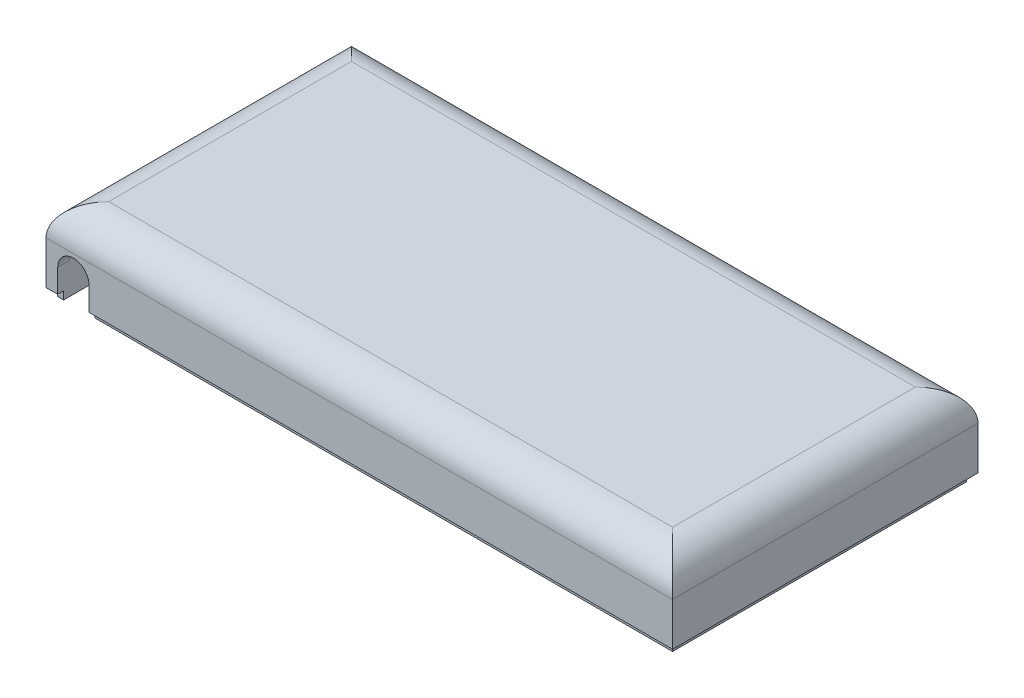
ISO-10303-21;
HEADER;
FILE_DESCRIPTION(('STEP AP214'),'2;1');
FILE_NAME('part.step','',(''),(''),'','','');
FILE_SCHEMA(('AUTOMOTIVE_DESIGN { 1 0 10303 214 1 1 1 1 }'));
ENDSEC;
DATA;
#1=APPLICATION_CONTEXT('core data for automotive mechanical design processes');
#2=APPLICATION_PROTOCOL_DEFINITION('international standard','automotive_design',2000,#1);
#3=PRODUCT_CONTEXT('',#1,'mechanical');
#4=PRODUCT('Part','Part','',(#3));
#5=PRODUCT_RELATED_PRODUCT_CATEGORY('part','',(#4));
#6=PRODUCT_DEFINITION_FORMATION('','',#4);
#7=PRODUCT_DEFINITION_CONTEXT('part definition',#1,'design');
#8=PRODUCT_DEFINITION('design','',#6,#7);
#9=PRODUCT_DEFINITION_SHAPE('','',#8);
#10=(LENGTH_UNIT() NAMED_UNIT(*) SI_UNIT(.MILLI.,.METRE.));
#11=(NAMED_UNIT(*) PLANE_ANGLE_UNIT() SI_UNIT($,.RADIAN.));
#12=(NAMED_UNIT(*) SI_UNIT($,.STERADIAN.) SOLID_ANGLE_UNIT());
#13=UNCERTAINTY_MEASURE_WITH_UNIT(LENGTH_MEASURE(1.E-05),#10,'distance_accuracy_value','');
#14=(GEOMETRIC_REPRESENTATION_CONTEXT(3) GLOBAL_UNCERTAINTY_ASSIGNED_CONTEXT((#13)) GLOBAL_UNIT_ASSIGNED_CONTEXT((#10,
#11,#12)) REPRESENTATION_CONTEXT('',''));
#15=CARTESIAN_POINT('',(0.,0.,0.));
#16=DIRECTION('',(0.,0.,1.));
#17=DIRECTION('',(1.,0.,0.));
#18=AXIS2_PLACEMENT_3D('',#15,#16,#17);
#19=CARTESIAN_POINT('',(39.25,1.,18.75));
#20=DIRECTION('',(0.,0.,1.));
#21=DIRECTION('',(1.,0.,0.));
#22=AXIS2_PLACEMENT_3D('',#19,#20,#21);
#23=PLANE('',#22);
#24=DIRECTION('',(0.,-1.,0.));
#25=VECTOR('',#24,1.);
#26=CARTESIAN_POINT('',(-34.5,-2.00000000000001,18.75));
#27=LINE('',#26,#25);
#28=CARTESIAN_POINT('',(-34.5,1.,18.75));
#29=VERTEX_POINT('',#28);
#30=CARTESIAN_POINT('',(-34.5,0.,18.75));
#31=VERTEX_POINT('',#30);
#32=EDGE_CURVE('E165',#29,#31,#27,.T.);
#33=ORIENTED_EDGE('',*,*,#32,.T.);
#34=DIRECTION('',(-1.,0.,0.));
#35=VECTOR('',#34,1.);
#36=CARTESIAN_POINT('',(39.25,0.,18.75));
#37=LINE('',#36,#35);
#38=CARTESIAN_POINT('',(39.25,0.,18.75));
#39=VERTEX_POINT('',#38);
#40=EDGE_CURVE('E210',#39,#31,#37,.T.);
#41=ORIENTED_EDGE('',*,*,#40,.F.);
#42=DIRECTION('',(0.,-1.,0.));
#43=VECTOR('',#42,1.);
#44=CARTESIAN_POINT('',(39.25,1.,18.75));
#45=LINE('',#44,#43);
#46=CARTESIAN_POINT('',(39.25,1.,18.75));
#47=VERTEX_POINT('',#46);
#48=EDGE_CURVE('E190',#47,#39,#45,.T.);
#49=ORIENTED_EDGE('',*,*,#48,.F.);
#50=DIRECTION('',(-1.,0.,0.));
#51=VECTOR('',#50,1.);
#52=CARTESIAN_POINT('',(39.25,1.,18.75));
#53=LINE('',#52,#51);
#54=EDGE_CURVE('E183',#47,#29,#53,.T.);
#55=ORIENTED_EDGE('',*,*,#54,.T.);
#56=EDGE_LOOP('',(#33,#41,#49,#55));
#57=FACE_BOUND('',#56,.T.);
#58=ADVANCED_FACE('F33',(#57),#23,.T.);
#59=CARTESIAN_POINT('',(0.,0.,0.));
#60=DIRECTION('',(0.,1.,0.));
#61=DIRECTION('',(0.,0.,1.));
#62=AXIS2_PLACEMENT_3D('',#59,#60,#61);
#63=PLANE('',#62);
#64=ORIENTED_EDGE('',*,*,#40,.T.);
#65=DIRECTION('',(0.,0.,1.));
#66=VECTOR('',#65,1.);
#67=CARTESIAN_POINT('',(-34.5,0.,-19.501));
#68=LINE('',#67,#66);
#69=CARTESIAN_POINT('',(-34.5,0.,18.));
#70=VERTEX_POINT('',#69);
#71=EDGE_CURVE('E172',#70,#31,#68,.T.);
#72=ORIENTED_EDGE('',*,*,#71,.F.);
#73=DIRECTION('',(1.,0.,0.));
#74=VECTOR('',#73,1.);
#75=CARTESIAN_POINT('',(-38.5,0.,18.));
#76=LINE('',#75,#74);
#77=CARTESIAN_POINT('',(38.5,0.,18.));
#78=VERTEX_POINT('',#77);
#79=EDGE_CURVE('E234',#70,#78,#76,.T.);
#80=ORIENTED_EDGE('',*,*,#79,.T.);
#81=DIRECTION('',(0.,0.,-1.));
#82=VECTOR('',#81,1.);
#83=CARTESIAN_POINT('',(38.5,0.,18.));
#84=LINE('',#83,#82);
#85=CARTESIAN_POINT('',(38.5,0.,-18.));
#86=VERTEX_POINT('',#85);
#87=EDGE_CURVE('E229',#78,#86,#84,.T.);
#88=ORIENTED_EDGE('',*,*,#87,.T.);
#89=DIRECTION('',(-1.,0.,0.));
#90=VECTOR('',#89,1.);
#91=CARTESIAN_POINT('',(-38.5,0.,-18.));
#92=LINE('',#91,#90);
#93=CARTESIAN_POINT('',(-38.5,0.,-18.));
#94=VERTEX_POINT('',#93);
#95=EDGE_CURVE('E246',#86,#94,#92,.T.);
#96=ORIENTED_EDGE('',*,*,#95,.T.);
#97=DIRECTION('',(0.,0.,1.));
#98=VECTOR('',#97,1.);
#99=CARTESIAN_POINT('',(-38.5,0.,18.));
#100=LINE('',#99,#98);
#101=CARTESIAN_POINT('',(-38.5,0.,18.75));
#102=VERTEX_POINT('',#101);
#103=EDGE_CURVE('E249',#94,#102,#100,.T.);
#104=ORIENTED_EDGE('',*,*,#103,.T.);
#105=CARTESIAN_POINT('',(-39.25,0.,18.75));
#106=VERTEX_POINT('',#105);
#107=EDGE_CURVE('E209',#102,#106,#37,.T.);
#108=ORIENTED_EDGE('',*,*,#107,.T.);
#109=DIRECTION('',(0.,0.,-1.));
#110=VECTOR('',#109,1.);
#111=CARTESIAN_POINT('',(-39.25,0.,-18.75));
#112=LINE('',#111,#110);
#113=CARTESIAN_POINT('',(-39.25,0.,-18.75));
#114=VERTEX_POINT('',#113);
#115=EDGE_CURVE('E200',#106,#114,#112,.T.);
#116=ORIENTED_EDGE('',*,*,#115,.T.);
#117=DIRECTION('',(1.,0.,0.));
#118=VECTOR('',#117,1.);
#119=CARTESIAN_POINT('',(39.25,0.,-18.75));
#120=LINE('',#119,#118);
#121=CARTESIAN_POINT('',(39.25,0.,-18.75));
#122=VERTEX_POINT('',#121);
#123=EDGE_CURVE('E203',#114,#122,#120,.T.);
#124=ORIENTED_EDGE('',*,*,#123,.T.);
#125=DIRECTION('',(0.,0.,1.));
#126=VECTOR('',#125,1.);
#127=CARTESIAN_POINT('',(39.25,0.,-18.75));
#128=LINE('',#127,#126);
#129=EDGE_CURVE('E206',#122,#39,#128,.T.);
#130=ORIENTED_EDGE('',*,*,#129,.T.);
#131=EDGE_LOOP('',(#64,#72,#80,#88,#96,#104,#108,#116,#124,#130));
#132=FACE_BOUND('',#131,.T.);
#133=ADVANCED_FACE('F335',(#132),#63,.F.);
#134=CARTESIAN_POINT('',(38.5,9.,18.));
#135=DIRECTION('',(-1.,0.,0.));
#136=DIRECTION('',(0.,0.,1.));
#137=AXIS2_PLACEMENT_3D('',#134,#135,#136);
#138=PLANE('',#137);
#139=ORIENTED_EDGE('',*,*,#87,.F.);
#140=DIRECTION('',(0.,-1.,0.));
#141=VECTOR('',#140,1.);
#142=CARTESIAN_POINT('',(38.5,9.,18.));
#143=LINE('',#142,#141);
#144=CARTESIAN_POINT('',(38.5,9.,18.));
#145=VERTEX_POINT('',#144);
#146=EDGE_CURVE('E243',#145,#78,#143,.T.);
#147=ORIENTED_EDGE('',*,*,#146,.F.);
#148=DIRECTION('',(0.,0.,-1.));
#149=VECTOR('',#148,1.);
#150=CARTESIAN_POINT('',(38.5,9.,18.));
#151=LINE('',#150,#149);
#152=CARTESIAN_POINT('',(38.5,9.,-18.));
#153=VERTEX_POINT('',#152);
#154=EDGE_CURVE('E230',#145,#153,#151,.T.);
#155=ORIENTED_EDGE('',*,*,#154,.T.);
#156=DIRECTION('',(0.,-1.,0.));
#157=VECTOR('',#156,1.);
#158=CARTESIAN_POINT('',(38.5,9.,-18.));
#159=LINE('',#158,#157);
#160=EDGE_CURVE('E259',#153,#86,#159,.T.);
#161=ORIENTED_EDGE('',*,*,#160,.T.);
#162=EDGE_LOOP('',(#139,#147,#155,#161));
#163=FACE_BOUND('',#162,.T.);
#164=ADVANCED_FACE('F341',(#163),#138,.T.);
#165=CARTESIAN_POINT('',(-38.5,9.,-18.));
#166=DIRECTION('',(0.,0.,1.));
#167=DIRECTION('',(1.,0.,0.));
#168=AXIS2_PLACEMENT_3D('',#165,#166,#167);
#169=PLANE('',#168);
#170=ORIENTED_EDGE('',*,*,#95,.F.);
#171=ORIENTED_EDGE('',*,*,#160,.F.);
#172=DIRECTION('',(-1.,0.,0.));
#173=VECTOR('',#172,1.);
#174=CARTESIAN_POINT('',(-38.5,9.,-18.));
#175=LINE('',#174,#173);
#176=CARTESIAN_POINT('',(-38.5,9.,-18.));
#177=VERTEX_POINT('',#176);
#178=EDGE_CURVE('E233',#153,#177,#175,.T.);
#179=ORIENTED_EDGE('',*,*,#178,.T.);
#180=DIRECTION('',(0.,-1.,0.));
#181=VECTOR('',#180,1.);
#182=CARTESIAN_POINT('',(-38.5,9.,-18.));
#183=LINE('',#182,#181);
#184=EDGE_CURVE('E257',#177,#94,#183,.T.);
#185=ORIENTED_EDGE('',*,*,#184,.T.);
#186=EDGE_LOOP('',(#170,#171,#179,#185));
#187=FACE_BOUND('',#186,.T.);
#188=ADVANCED_FACE('F400',(#187),#169,.T.);
#189=CARTESIAN_POINT('',(-38.5,9.,18.));
#190=DIRECTION('',(1.,0.,0.));
#191=DIRECTION('',(0.,0.,-1.));
#192=AXIS2_PLACEMENT_3D('',#189,#190,#191);
#193=PLANE('',#192);
#194=ORIENTED_EDGE('',*,*,#103,.F.);
#195=ORIENTED_EDGE('',*,*,#184,.F.);
#196=DIRECTION('',(0.,0.,1.));
#197=VECTOR('',#196,1.);
#198=CARTESIAN_POINT('',(-38.5,9.,18.));
#199=LINE('',#198,#197);
#200=CARTESIAN_POINT('',(-38.5,9.,18.));
#201=VERTEX_POINT('',#200);
#202=EDGE_CURVE('E237',#177,#201,#199,.T.);
#203=ORIENTED_EDGE('',*,*,#202,.T.);
#204=DIRECTION('',(0.,-1.,0.));
#205=VECTOR('',#204,1.);
#206=CARTESIAN_POINT('',(-38.5,9.,18.));
#207=LINE('',#206,#205);
#208=CARTESIAN_POINT('',(-38.5,4.,18.));
#209=VERTEX_POINT('',#208);
#210=EDGE_CURVE('E254',#201,#209,#207,.T.);
#211=ORIENTED_EDGE('',*,*,#210,.T.);
#212=DIRECTION('',(0.,0.,1.));
#213=VECTOR('',#212,1.);
#214=CARTESIAN_POINT('',(-38.5,4.00000000000001,-19.501));
#215=LINE('',#214,#213);
#216=CARTESIAN_POINT('',(-38.5,4.00000000000001,19.5));
#217=VERTEX_POINT('',#216);
#218=EDGE_CURVE('E177',#209,#217,#215,.T.);
#219=ORIENTED_EDGE('',*,*,#218,.T.);
#220=DIRECTION('',(0.,-1.,0.));
#221=VECTOR('',#220,1.);
#222=CARTESIAN_POINT('',(-38.5,-2.,19.5));
#223=LINE('',#222,#221);
#224=CARTESIAN_POINT('',(-38.5,1.,19.5));
#225=VERTEX_POINT('',#224);
#226=EDGE_CURVE('E380',#217,#225,#223,.T.);
#227=ORIENTED_EDGE('',*,*,#226,.T.);
#228=DIRECTION('',(0.,0.,1.));
#229=VECTOR('',#228,1.);
#230=CARTESIAN_POINT('',(-38.5,1.,-19.501));
#231=LINE('',#230,#229);
#232=CARTESIAN_POINT('',(-38.5,1.,18.75));
#233=VERTEX_POINT('',#232);
#234=EDGE_CURVE('E188',#233,#225,#231,.T.);
#235=ORIENTED_EDGE('',*,*,#234,.F.);
#236=DIRECTION('',(0.,1.,0.));
#237=VECTOR('',#236,1.);
#238=CARTESIAN_POINT('',(-38.5,-2.,18.75));
#239=LINE('',#238,#237);
#240=EDGE_CURVE('E359',#102,#233,#239,.T.);
#241=ORIENTED_EDGE('',*,*,#240,.F.);
#242=EDGE_LOOP('',(#194,#195,#203,#211,#219,#227,#235,#241));
#243=FACE_BOUND('',#242,.T.);
#244=ADVANCED_FACE('F393',(#243),#193,.T.);
#245=CARTESIAN_POINT('',(-38.5,9.,18.));
#246=DIRECTION('',(0.,0.,-1.));
#247=DIRECTION('',(-1.,0.,0.));
#248=AXIS2_PLACEMENT_3D('',#245,#246,#247);
#249=PLANE('',#248);
#250=DIRECTION('',(0.,1.,0.));
#251=VECTOR('',#250,1.);
#252=CARTESIAN_POINT('',(-34.5,-2.00000000000001,18.));
#253=LINE('',#252,#251);
#254=CARTESIAN_POINT('',(-34.5,4.00000000000001,18.));
#255=VERTEX_POINT('',#254);
#256=EDGE_CURVE('E288',#70,#255,#253,.T.);
#257=ORIENTED_EDGE('',*,*,#256,.T.);
#258=CARTESIAN_POINT('',(-36.5,4.,18.));
#259=DIRECTION('',(0.,0.,-1.));
#260=DIRECTION('',(-1.,0.,0.));
#261=AXIS2_PLACEMENT_3D('',#258,#259,#260);
#262=CIRCLE('',#261,2.);
#263=EDGE_CURVE('E364',#255,#209,#262,.F.);
#264=ORIENTED_EDGE('',*,*,#263,.T.);
#265=ORIENTED_EDGE('',*,*,#210,.F.);
#266=DIRECTION('',(1.,0.,0.));
#267=VECTOR('',#266,1.);
#268=CARTESIAN_POINT('',(-38.5,9.,18.));
#269=LINE('',#268,#267);
#270=EDGE_CURVE('E240',#201,#145,#269,.T.);
#271=ORIENTED_EDGE('',*,*,#270,.T.);
#272=ORIENTED_EDGE('',*,*,#146,.T.);
#273=ORIENTED_EDGE('',*,*,#79,.F.);
#274=EDGE_LOOP('',(#257,#264,#265,#271,#272,#273));
#275=FACE_BOUND('',#274,.T.);
#276=ADVANCED_FACE('F390',(#275),#249,.T.);
#277=CARTESIAN_POINT('',(0.,9.,0.));
#278=DIRECTION('',(0.,-1.,0.));
#279=DIRECTION('',(0.,0.,-1.));
#280=AXIS2_PLACEMENT_3D('',#277,#278,#279);
#281=PLANE('',#280);
#282=ORIENTED_EDGE('',*,*,#178,.F.);
#283=ORIENTED_EDGE('',*,*,#154,.F.);
#284=ORIENTED_EDGE('',*,*,#270,.F.);
#285=ORIENTED_EDGE('',*,*,#202,.F.);
#286=EDGE_LOOP('',(#282,#283,#284,#285));
#287=FACE_BOUND('',#286,.T.);
#288=ADVANCED_FACE('F397',(#287),#281,.T.);
#289=CARTESIAN_POINT('',(0.,1.,0.));
#290=DIRECTION('',(0.,-1.,0.));
#291=DIRECTION('',(0.,0.,-1.));
#292=AXIS2_PLACEMENT_3D('',#289,#290,#291);
#293=PLANE('',#292);
#294=DIRECTION('',(0.,0.,-1.));
#295=VECTOR('',#294,1.);
#296=CARTESIAN_POINT('',(-34.5,1.,-19.501));
#297=LINE('',#296,#295);
#298=CARTESIAN_POINT('',(-34.5,0.999999999999999,19.5));
#299=VERTEX_POINT('',#298);
#300=EDGE_CURVE('E169',#299,#29,#297,.T.);
#301=ORIENTED_EDGE('',*,*,#300,.T.);
#302=ORIENTED_EDGE('',*,*,#54,.F.);
#303=DIRECTION('',(0.,0.,1.));
#304=VECTOR('',#303,1.);
#305=CARTESIAN_POINT('',(39.25,1.,-18.75));
#306=LINE('',#305,#304);
#307=CARTESIAN_POINT('',(39.25,1.,-18.75));
#308=VERTEX_POINT('',#307);
#309=EDGE_CURVE('E196',#308,#47,#306,.T.);
#310=ORIENTED_EDGE('',*,*,#309,.F.);
#311=DIRECTION('',(1.,0.,0.));
#312=VECTOR('',#311,1.);
#313=CARTESIAN_POINT('',(39.25,1.,-18.75));
#314=LINE('',#313,#312);
#315=CARTESIAN_POINT('',(-39.25,1.,-18.75));
#316=VERTEX_POINT('',#315);
#317=EDGE_CURVE('E372',#316,#308,#314,.T.);
#318=ORIENTED_EDGE('',*,*,#317,.F.);
#319=DIRECTION('',(0.,0.,-1.));
#320=VECTOR('',#319,1.);
#321=CARTESIAN_POINT('',(-39.25,1.,-18.75));
#322=LINE('',#321,#320);
#323=CARTESIAN_POINT('',(-39.25,1.,18.75));
#324=VERTEX_POINT('',#323);
#325=EDGE_CURVE('E212',#324,#316,#322,.T.);
#326=ORIENTED_EDGE('',*,*,#325,.F.);
#327=EDGE_CURVE('E192',#233,#324,#53,.T.);
#328=ORIENTED_EDGE('',*,*,#327,.F.);
#329=ORIENTED_EDGE('',*,*,#234,.T.);
#330=DIRECTION('',(-1.,0.,0.));
#331=VECTOR('',#330,1.);
#332=CARTESIAN_POINT('',(40.,1.,19.5));
#333=LINE('',#332,#331);
#334=CARTESIAN_POINT('',(-40.,1.,19.5));
#335=VERTEX_POINT('',#334);
#336=EDGE_CURVE('E227',#225,#335,#333,.T.);
#337=ORIENTED_EDGE('',*,*,#336,.T.);
#338=DIRECTION('',(0.,0.,-1.));
#339=VECTOR('',#338,1.);
#340=CARTESIAN_POINT('',(-40.,1.,-19.5));
#341=LINE('',#340,#339);
#342=CARTESIAN_POINT('',(-40.,0.999999999999999,-19.5));
#343=VERTEX_POINT('',#342);
#344=EDGE_CURVE('E216',#335,#343,#341,.T.);
#345=ORIENTED_EDGE('',*,*,#344,.T.);
#346=DIRECTION('',(1.,0.,0.));
#347=VECTOR('',#346,1.);
#348=CARTESIAN_POINT('',(40.,1.,-19.5));
#349=LINE('',#348,#347);
#350=CARTESIAN_POINT('',(40.,1.,-19.5));
#351=VERTEX_POINT('',#350);
#352=EDGE_CURVE('E222',#343,#351,#349,.T.);
#353=ORIENTED_EDGE('',*,*,#352,.T.);
#354=DIRECTION('',(0.,0.,1.));
#355=VECTOR('',#354,1.);
#356=CARTESIAN_POINT('',(40.,1.,-19.5));
#357=LINE('',#356,#355);
#358=CARTESIAN_POINT('',(40.,1.,19.5));
#359=VERTEX_POINT('',#358);
#360=EDGE_CURVE('E225',#351,#359,#357,.T.);
#361=ORIENTED_EDGE('',*,*,#360,.T.);
#362=EDGE_CURVE('E187',#359,#299,#333,.T.);
#363=ORIENTED_EDGE('',*,*,#362,.T.);
#364=EDGE_LOOP('',(#301,#302,#310,#318,#326,#328,#329,#337,#345,#353,#361,#363));
#365=FACE_BOUND('',#364,.T.);
#366=ADVANCED_FACE('F182',(#365),#293,.T.);
#367=CARTESIAN_POINT('',(-39.25,1.,-18.75));
#368=DIRECTION('',(-1.,0.,0.));
#369=DIRECTION('',(0.,0.,1.));
#370=AXIS2_PLACEMENT_3D('',#367,#368,#369);
#371=PLANE('',#370);
#372=ORIENTED_EDGE('',*,*,#115,.F.);
#373=DIRECTION('',(0.,-1.,0.));
#374=VECTOR('',#373,1.);
#375=CARTESIAN_POINT('',(-39.25,1.,18.75));
#376=LINE('',#375,#374);
#377=EDGE_CURVE('E213',#324,#106,#376,.T.);
#378=ORIENTED_EDGE('',*,*,#377,.F.);
#379=ORIENTED_EDGE('',*,*,#325,.T.);
#380=DIRECTION('',(0.,-1.,0.));
#381=VECTOR('',#380,1.);
#382=CARTESIAN_POINT('',(-39.25,1.,-18.75));
#383=LINE('',#382,#381);
#384=EDGE_CURVE('E191',#316,#114,#383,.T.);
#385=ORIENTED_EDGE('',*,*,#384,.T.);
#386=EDGE_LOOP('',(#372,#378,#379,#385));
#387=FACE_BOUND('',#386,.T.);
#388=ADVANCED_FACE('F347',(#387),#371,.T.);
#389=ORIENTED_EDGE('',*,*,#240,.T.);
#390=ORIENTED_EDGE('',*,*,#327,.T.);
#391=ORIENTED_EDGE('',*,*,#377,.T.);
#392=ORIENTED_EDGE('',*,*,#107,.F.);
#393=EDGE_LOOP('',(#389,#390,#391,#392));
#394=FACE_BOUND('',#393,.T.);
#395=ADVANCED_FACE('F337',(#394),#23,.T.);
#396=CARTESIAN_POINT('',(39.25,1.,-18.75));
#397=DIRECTION('',(1.,0.,0.));
#398=DIRECTION('',(0.,0.,-1.));
#399=AXIS2_PLACEMENT_3D('',#396,#397,#398);
#400=PLANE('',#399);
#401=ORIENTED_EDGE('',*,*,#129,.F.);
#402=DIRECTION('',(0.,-1.,0.));
#403=VECTOR('',#402,1.);
#404=CARTESIAN_POINT('',(39.25,1.,-18.75));
#405=LINE('',#404,#403);
#406=EDGE_CURVE('E194',#308,#122,#405,.T.);
#407=ORIENTED_EDGE('',*,*,#406,.F.);
#408=ORIENTED_EDGE('',*,*,#309,.T.);
#409=ORIENTED_EDGE('',*,*,#48,.T.);
#410=EDGE_LOOP('',(#401,#407,#408,#409));
#411=FACE_BOUND('',#410,.T.);
#412=ADVANCED_FACE('F329',(#411),#400,.T.);
#413=CARTESIAN_POINT('',(39.25,1.,-18.75));
#414=DIRECTION('',(0.,0.,-1.));
#415=DIRECTION('',(-1.,0.,0.));
#416=AXIS2_PLACEMENT_3D('',#413,#414,#415);
#417=PLANE('',#416);
#418=ORIENTED_EDGE('',*,*,#123,.F.);
#419=ORIENTED_EDGE('',*,*,#384,.F.);
#420=ORIENTED_EDGE('',*,*,#317,.T.);
#421=ORIENTED_EDGE('',*,*,#406,.T.);
#422=EDGE_LOOP('',(#418,#419,#420,#421));
#423=FACE_BOUND('',#422,.T.);
#424=ADVANCED_FACE('F321',(#423),#417,.T.);
#425=CARTESIAN_POINT('',(0.,10.5,0.));
#426=DIRECTION('',(0.,-1.,0.));
#427=DIRECTION('',(0.,0.,-1.));
#428=AXIS2_PLACEMENT_3D('',#425,#426,#427);
#429=PLANE('',#428);
#430=DIRECTION('',(0.,0.,-1.));
#431=VECTOR('',#430,1.);
#432=CARTESIAN_POINT('',(36.,10.5,0.));
#433=LINE('',#432,#431);
#434=CARTESIAN_POINT('',(36.,10.5,15.5));
#435=VERTEX_POINT('',#434);
#436=CARTESIAN_POINT('',(36.,10.5,-15.5));
#437=VERTEX_POINT('',#436);
#438=EDGE_CURVE('E274',#435,#437,#433,.T.);
#439=ORIENTED_EDGE('',*,*,#438,.T.);
#440=DIRECTION('',(-1.,0.,0.));
#441=VECTOR('',#440,1.);
#442=CARTESIAN_POINT('',(0.,10.5,-15.5));
#443=LINE('',#442,#441);
#444=CARTESIAN_POINT('',(-36.,10.5,-15.5));
#445=VERTEX_POINT('',#444);
#446=EDGE_CURVE('E276',#437,#445,#443,.T.);
#447=ORIENTED_EDGE('',*,*,#446,.T.);
#448=DIRECTION('',(0.,0.,1.));
#449=VECTOR('',#448,1.);
#450=CARTESIAN_POINT('',(-36.,10.5,0.));
#451=LINE('',#450,#449);
#452=CARTESIAN_POINT('',(-36.,10.5,15.5));
#453=VERTEX_POINT('',#452);
#454=EDGE_CURVE('E270',#445,#453,#451,.T.);
#455=ORIENTED_EDGE('',*,*,#454,.T.);
#456=DIRECTION('',(1.,0.,0.));
#457=VECTOR('',#456,1.);
#458=CARTESIAN_POINT('',(0.,10.5,15.5));
#459=LINE('',#458,#457);
#460=EDGE_CURVE('E272',#453,#435,#459,.T.);
#461=ORIENTED_EDGE('',*,*,#460,.T.);
#462=EDGE_LOOP('',(#439,#447,#455,#461));
#463=FACE_BOUND('',#462,.T.);
#464=ADVANCED_FACE('F319',(#463),#429,.F.);
#465=CARTESIAN_POINT('',(40.,9.,-19.5));
#466=DIRECTION('',(0.,0.,1.));
#467=DIRECTION('',(1.,0.,0.));
#468=AXIS2_PLACEMENT_3D('',#465,#466,#467);
#469=PLANE('',#468);
#470=DIRECTION('',(0.,-1.,0.));
#471=VECTOR('',#470,1.);
#472=CARTESIAN_POINT('',(-40.,9.,-19.5));
#473=LINE('',#472,#471);
#474=CARTESIAN_POINT('',(-40.,6.5,-19.5));
#475=VERTEX_POINT('',#474);
#476=EDGE_CURVE('E262',#475,#343,#473,.T.);
#477=ORIENTED_EDGE('',*,*,#476,.F.);
#478=DIRECTION('',(-1.,0.,0.));
#479=VECTOR('',#478,1.);
#480=CARTESIAN_POINT('',(40.,6.5,-19.5));
#481=LINE('',#480,#479);
#482=CARTESIAN_POINT('',(40.,6.5,-19.5));
#483=VERTEX_POINT('',#482);
#484=EDGE_CURVE('E279',#475,#483,#481,.F.);
#485=ORIENTED_EDGE('',*,*,#484,.T.);
#486=DIRECTION('',(0.,-1.,0.));
#487=VECTOR('',#486,1.);
#488=CARTESIAN_POINT('',(40.,9.,-19.5));
#489=LINE('',#488,#487);
#490=EDGE_CURVE('E264',#483,#351,#489,.T.);
#491=ORIENTED_EDGE('',*,*,#490,.T.);
#492=ORIENTED_EDGE('',*,*,#352,.F.);
#493=EDGE_LOOP('',(#477,#485,#491,#492));
#494=FACE_BOUND('',#493,.T.);
#495=ADVANCED_FACE('F313',(#494),#469,.F.);
#496=CARTESIAN_POINT('',(40.,9.,19.5));
#497=DIRECTION('',(-1.,0.,0.));
#498=DIRECTION('',(0.,0.,1.));
#499=AXIS2_PLACEMENT_3D('',#496,#497,#498);
#500=PLANE('',#499);
#501=ORIENTED_EDGE('',*,*,#490,.F.);
#502=DIRECTION('',(0.,0.,-1.));
#503=VECTOR('',#502,1.);
#504=CARTESIAN_POINT('',(40.,6.5,19.5));
#505=LINE('',#504,#503);
#506=CARTESIAN_POINT('',(40.,6.5,19.5));
#507=VERTEX_POINT('',#506);
#508=EDGE_CURVE('E282',#483,#507,#505,.F.);
#509=ORIENTED_EDGE('',*,*,#508,.T.);
#510=DIRECTION('',(0.,-1.,0.));
#511=VECTOR('',#510,1.);
#512=CARTESIAN_POINT('',(40.,9.,19.5));
#513=LINE('',#512,#511);
#514=EDGE_CURVE('E266',#507,#359,#513,.T.);
#515=ORIENTED_EDGE('',*,*,#514,.T.);
#516=ORIENTED_EDGE('',*,*,#360,.F.);
#517=EDGE_LOOP('',(#501,#509,#515,#516));
#518=FACE_BOUND('',#517,.T.);
#519=ADVANCED_FACE('F327',(#518),#500,.F.);
#520=CARTESIAN_POINT('',(40.,9.,19.5));
#521=DIRECTION('',(0.,0.,-1.));
#522=DIRECTION('',(-1.,0.,0.));
#523=AXIS2_PLACEMENT_3D('',#520,#521,#522);
#524=PLANE('',#523);
#525=CARTESIAN_POINT('',(-36.5,4.,19.5));
#526=DIRECTION('',(0.,0.,1.));
#527=DIRECTION('',(1.,0.,0.));
#528=AXIS2_PLACEMENT_3D('',#525,#526,#527);
#529=CIRCLE('',#528,2.);
#530=CARTESIAN_POINT('',(-34.5,4.00000000000001,19.5));
#531=VERTEX_POINT('',#530);
#532=EDGE_CURVE('E50',#531,#217,#529,.T.);
#533=ORIENTED_EDGE('',*,*,#532,.F.);
#534=DIRECTION('',(0.,1.,0.));
#535=VECTOR('',#534,1.);
#536=CARTESIAN_POINT('',(-34.5,-2.00000000000001,19.5));
#537=LINE('',#536,#535);
#538=EDGE_CURVE('E384',#299,#531,#537,.T.);
#539=ORIENTED_EDGE('',*,*,#538,.F.);
#540=ORIENTED_EDGE('',*,*,#362,.F.);
#541=ORIENTED_EDGE('',*,*,#514,.F.);
#542=DIRECTION('',(1.,0.,0.));
#543=VECTOR('',#542,1.);
#544=CARTESIAN_POINT('',(40.,6.5,19.5));
#545=LINE('',#544,#543);
#546=CARTESIAN_POINT('',(-40.,6.5,19.5));
#547=VERTEX_POINT('',#546);
#548=EDGE_CURVE('E42',#507,#547,#545,.F.);
#549=ORIENTED_EDGE('',*,*,#548,.T.);
#550=DIRECTION('',(0.,-1.,0.));
#551=VECTOR('',#550,1.);
#552=CARTESIAN_POINT('',(-40.,9.,19.5));
#553=LINE('',#552,#551);
#554=EDGE_CURVE('E268',#547,#335,#553,.T.);
#555=ORIENTED_EDGE('',*,*,#554,.T.);
#556=ORIENTED_EDGE('',*,*,#336,.F.);
#557=ORIENTED_EDGE('',*,*,#226,.F.);
#558=EDGE_LOOP('',(#533,#539,#540,#541,#549,#555,#556,#557));
#559=FACE_BOUND('',#558,.T.);
#560=ADVANCED_FACE('F417',(#559),#524,.F.);
#561=CARTESIAN_POINT('',(-40.,9.,19.5));
#562=DIRECTION('',(1.,0.,0.));
#563=DIRECTION('',(0.,0.,-1.));
#564=AXIS2_PLACEMENT_3D('',#561,#562,#563);
#565=PLANE('',#564);
#566=ORIENTED_EDGE('',*,*,#554,.F.);
#567=DIRECTION('',(0.,0.,1.));
#568=VECTOR('',#567,1.);
#569=CARTESIAN_POINT('',(-40.,6.5,19.5));
#570=LINE('',#569,#568);
#571=EDGE_CURVE('E11',#547,#475,#570,.F.);
#572=ORIENTED_EDGE('',*,*,#571,.T.);
#573=ORIENTED_EDGE('',*,*,#476,.T.);
#574=ORIENTED_EDGE('',*,*,#344,.F.);
#575=EDGE_LOOP('',(#566,#572,#573,#574));
#576=FACE_BOUND('',#575,.T.);
#577=ADVANCED_FACE('F308',(#576),#565,.F.);
#578=CARTESIAN_POINT('',(0.,6.5,15.5));
#579=DIRECTION('',(1.,0.,0.));
#580=DIRECTION('',(0.,0.,-1.));
#581=AXIS2_PLACEMENT_3D('',#578,#579,#580);
#582=CYLINDRICAL_SURFACE('',#581,4.);
#583=CARTESIAN_POINT('',(-36.,6.5,15.5));
#584=DIRECTION('',(0.707106781186547,0.,0.707106781186547));
#585=DIRECTION('',(-0.707106781186547,0.,0.707106781186547));
#586=AXIS2_PLACEMENT_3D('',#583,#584,#585);
#587=ELLIPSE('',#586,5.65685424949238,4.);
#588=EDGE_CURVE('E289',#547,#453,#587,.F.);
#589=ORIENTED_EDGE('',*,*,#588,.F.);
#590=ORIENTED_EDGE('',*,*,#548,.F.);
#591=CARTESIAN_POINT('',(36.,6.5,15.5));
#592=DIRECTION('',(0.707106781186547,0.,-0.707106781186547));
#593=DIRECTION('',(0.707106781186547,0.,0.707106781186547));
#594=AXIS2_PLACEMENT_3D('',#591,#592,#593);
#595=ELLIPSE('',#594,5.65685424949238,4.);
#596=EDGE_CURVE('E37',#435,#507,#595,.T.);
#597=ORIENTED_EDGE('',*,*,#596,.F.);
#598=ORIENTED_EDGE('',*,*,#460,.F.);
#599=EDGE_LOOP('',(#589,#590,#597,#598));
#600=FACE_BOUND('',#599,.T.);
#601=ADVANCED_FACE('F35',(#600),#582,.T.);
#602=CARTESIAN_POINT('',(36.,6.5,0.));
#603=DIRECTION('',(0.,0.,-1.));
#604=DIRECTION('',(-1.,0.,0.));
#605=AXIS2_PLACEMENT_3D('',#602,#603,#604);
#606=CYLINDRICAL_SURFACE('',#605,4.);
#607=ORIENTED_EDGE('',*,*,#596,.T.);
#608=ORIENTED_EDGE('',*,*,#508,.F.);
#609=CARTESIAN_POINT('',(36.,6.5,-15.5));
#610=DIRECTION('',(-0.707106781186547,0.,-0.707106781186547));
#611=DIRECTION('',(0.707106781186547,0.,-0.707106781186547));
#612=AXIS2_PLACEMENT_3D('',#609,#610,#611);
#613=ELLIPSE('',#612,5.65685424949238,4.);
#614=EDGE_CURVE('E287',#437,#483,#613,.T.);
#615=ORIENTED_EDGE('',*,*,#614,.F.);
#616=ORIENTED_EDGE('',*,*,#438,.F.);
#617=EDGE_LOOP('',(#607,#608,#615,#616));
#618=FACE_BOUND('',#617,.T.);
#619=ADVANCED_FACE('F300',(#618),#606,.T.);
#620=CARTESIAN_POINT('',(-36.,6.5,0.));
#621=DIRECTION('',(0.,0.,1.));
#622=DIRECTION('',(1.,0.,0.));
#623=AXIS2_PLACEMENT_3D('',#620,#621,#622);
#624=CYLINDRICAL_SURFACE('',#623,4.);
#625=ORIENTED_EDGE('',*,*,#588,.T.);
#626=ORIENTED_EDGE('',*,*,#454,.F.);
#627=CARTESIAN_POINT('',(-36.,6.5,-15.5));
#628=DIRECTION('',(-0.707106781186547,0.,0.707106781186547));
#629=DIRECTION('',(0.707106781186547,0.,0.707106781186547));
#630=AXIS2_PLACEMENT_3D('',#627,#628,#629);
#631=ELLIPSE('',#630,5.65685424949238,4.);
#632=EDGE_CURVE('E285',#475,#445,#631,.F.);
#633=ORIENTED_EDGE('',*,*,#632,.F.);
#634=ORIENTED_EDGE('',*,*,#571,.F.);
#635=EDGE_LOOP('',(#625,#626,#633,#634));
#636=FACE_BOUND('',#635,.T.);
#637=ADVANCED_FACE('F305',(#636),#624,.T.);
#638=CARTESIAN_POINT('',(0.,6.5,-15.5));
#639=DIRECTION('',(-1.,0.,0.));
#640=DIRECTION('',(0.,0.,1.));
#641=AXIS2_PLACEMENT_3D('',#638,#639,#640);
#642=CYLINDRICAL_SURFACE('',#641,4.);
#643=ORIENTED_EDGE('',*,*,#614,.T.);
#644=ORIENTED_EDGE('',*,*,#484,.F.);
#645=ORIENTED_EDGE('',*,*,#632,.T.);
#646=ORIENTED_EDGE('',*,*,#446,.F.);
#647=EDGE_LOOP('',(#643,#644,#645,#646));
#648=FACE_BOUND('',#647,.T.);
#649=ADVANCED_FACE('F316',(#648),#642,.T.);
#650=CARTESIAN_POINT('',(-34.5,-2.00000000000001,-19.501));
#651=DIRECTION('',(1.,0.,0.));
#652=DIRECTION('',(0.,0.,-1.));
#653=AXIS2_PLACEMENT_3D('',#650,#651,#652);
#654=PLANE('',#653);
#655=ORIENTED_EDGE('',*,*,#71,.T.);
#656=ORIENTED_EDGE('',*,*,#32,.F.);
#657=ORIENTED_EDGE('',*,*,#300,.F.);
#658=ORIENTED_EDGE('',*,*,#538,.T.);
#659=DIRECTION('',(0.,0.,1.));
#660=VECTOR('',#659,1.);
#661=CARTESIAN_POINT('',(-34.5,4.00000000000001,-19.501));
#662=LINE('',#661,#660);
#663=EDGE_CURVE('E378',#255,#531,#662,.T.);
#664=ORIENTED_EDGE('',*,*,#663,.F.);
#665=ORIENTED_EDGE('',*,*,#256,.F.);
#666=EDGE_LOOP('',(#655,#656,#657,#658,#664,#665));
#667=FACE_BOUND('',#666,.T.);
#668=ADVANCED_FACE('F167',(#667),#654,.F.);
#669=CARTESIAN_POINT('',(-36.5,4.,-19.501));
#670=DIRECTION('',(0.,0.,1.));
#671=DIRECTION('',(1.,0.,0.));
#672=AXIS2_PLACEMENT_3D('',#669,#670,#671);
#673=CYLINDRICAL_SURFACE('',#672,2.);
#674=ORIENTED_EDGE('',*,*,#663,.T.);
#675=ORIENTED_EDGE('',*,*,#532,.T.);
#676=ORIENTED_EDGE('',*,*,#218,.F.);
#677=ORIENTED_EDGE('',*,*,#263,.F.);
#678=EDGE_LOOP('',(#674,#675,#676,#677));
#679=FACE_BOUND('',#678,.T.);
#680=ADVANCED_FACE('F564',(#679),#673,.F.);
#681=CLOSED_SHELL('',(#58,#133,#164,#188,#244,#276,#288,#366,#388,#395,#412,#424,#464,#495,#519,
#560,#577,#601,#619,#637,#649,#668,#680));
#682=MANIFOLD_SOLID_BREP('B2',#681);
#683=ADVANCED_BREP_SHAPE_REPRESENTATION('',(#18,#682),#14);
#684=SHAPE_DEFINITION_REPRESENTATION(#9,#683);
ENDSEC;
END-ISO-10303-21;
